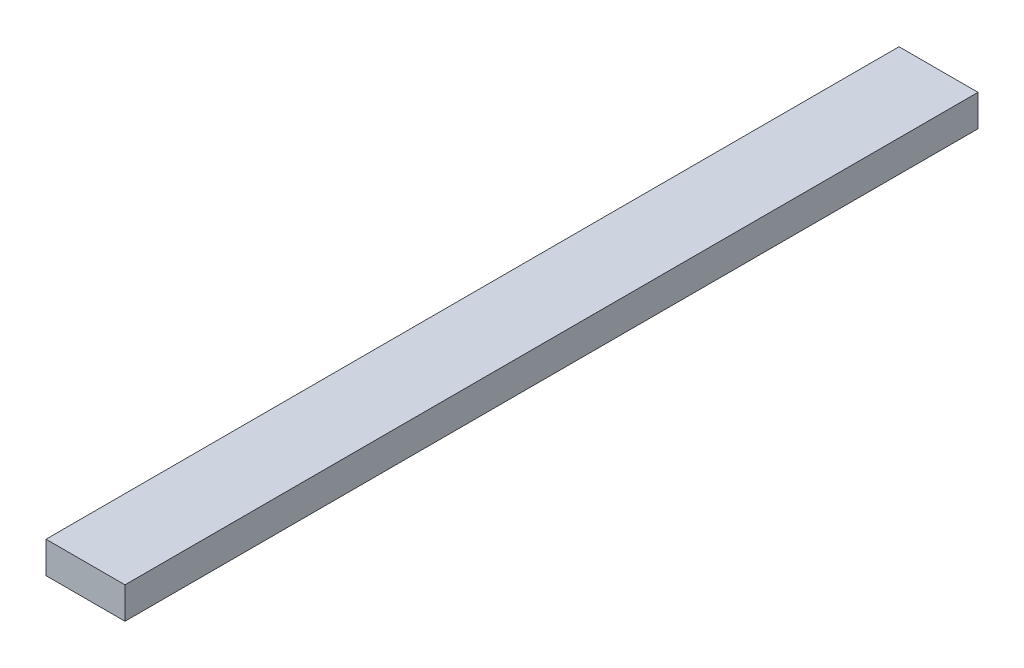
ISO-10303-21;
HEADER;
FILE_DESCRIPTION(('STEP AP214'),'2;1');
FILE_NAME('part.step','',(''),(''),'','','');
FILE_SCHEMA(('AUTOMOTIVE_DESIGN { 1 0 10303 214 1 1 1 1 }'));
ENDSEC;
DATA;
#1=APPLICATION_CONTEXT('core data for automotive mechanical design processes');
#2=APPLICATION_PROTOCOL_DEFINITION('international standard','automotive_design',2000,#1);
#3=PRODUCT_CONTEXT('',#1,'mechanical');
#4=PRODUCT('Part','Part','',(#3));
#5=PRODUCT_RELATED_PRODUCT_CATEGORY('part','',(#4));
#6=PRODUCT_DEFINITION_FORMATION('','',#4);
#7=PRODUCT_DEFINITION_CONTEXT('part definition',#1,'design');
#8=PRODUCT_DEFINITION('design','',#6,#7);
#9=PRODUCT_DEFINITION_SHAPE('','',#8);
#10=(LENGTH_UNIT() NAMED_UNIT(*) SI_UNIT(.MILLI.,.METRE.));
#11=(NAMED_UNIT(*) PLANE_ANGLE_UNIT() SI_UNIT($,.RADIAN.));
#12=(NAMED_UNIT(*) SI_UNIT($,.STERADIAN.) SOLID_ANGLE_UNIT());
#13=UNCERTAINTY_MEASURE_WITH_UNIT(LENGTH_MEASURE(1.E-05),#10,'distance_accuracy_value','');
#14=(GEOMETRIC_REPRESENTATION_CONTEXT(3) GLOBAL_UNCERTAINTY_ASSIGNED_CONTEXT((#13)) GLOBAL_UNIT_ASSIGNED_CONTEXT((#10,
#11,#12)) REPRESENTATION_CONTEXT('',''));
#15=CARTESIAN_POINT('',(0.,0.,0.));
#16=DIRECTION('',(0.,0.,1.));
#17=DIRECTION('',(1.,0.,0.));
#18=AXIS2_PLACEMENT_3D('',#15,#16,#17);
#19=CARTESIAN_POINT('',(0.,10.,0.));
#20=DIRECTION('',(1.,0.,0.));
#21=DIRECTION('',(0.,0.,-1.));
#22=AXIS2_PLACEMENT_3D('',#19,#20,#21);
#23=PLANE('',#22);
#24=DIRECTION('',(0.,0.,1.));
#25=VECTOR('',#24,1.);
#26=CARTESIAN_POINT('',(0.,0.,0.));
#27=LINE('',#26,#25);
#28=CARTESIAN_POINT('',(0.,0.,-270.));
#29=VERTEX_POINT('',#28);
#30=CARTESIAN_POINT('',(0.,0.,0.));
#31=VERTEX_POINT('',#30);
#32=EDGE_CURVE('E96',#29,#31,#27,.T.);
#33=ORIENTED_EDGE('',*,*,#32,.T.);
#34=DIRECTION('',(0.,-1.,0.));
#35=VECTOR('',#34,1.);
#36=CARTESIAN_POINT('',(0.,10.,0.));
#37=LINE('',#36,#35);
#38=CARTESIAN_POINT('',(0.,10.,0.));
#39=VERTEX_POINT('',#38);
#40=EDGE_CURVE('E11',#39,#31,#37,.T.);
#41=ORIENTED_EDGE('',*,*,#40,.F.);
#42=DIRECTION('',(0.,0.,1.));
#43=VECTOR('',#42,1.);
#44=CARTESIAN_POINT('',(0.,10.,0.));
#45=LINE('',#44,#43);
#46=CARTESIAN_POINT('',(0.,10.,-270.));
#47=VERTEX_POINT('',#46);
#48=EDGE_CURVE('E84',#47,#39,#45,.T.);
#49=ORIENTED_EDGE('',*,*,#48,.F.);
#50=DIRECTION('',(0.,-1.,0.));
#51=VECTOR('',#50,1.);
#52=CARTESIAN_POINT('',(0.,10.,-270.));
#53=LINE('',#52,#51);
#54=EDGE_CURVE('E92',#47,#29,#53,.T.);
#55=ORIENTED_EDGE('',*,*,#54,.T.);
#56=EDGE_LOOP('',(#33,#41,#49,#55));
#57=FACE_BOUND('',#56,.T.);
#58=ADVANCED_FACE('F33',(#57),#23,.F.);
#59=CARTESIAN_POINT('',(0.,10.,0.));
#60=DIRECTION('',(0.,0.,-1.));
#61=DIRECTION('',(-1.,0.,0.));
#62=AXIS2_PLACEMENT_3D('',#59,#60,#61);
#63=PLANE('',#62);
#64=DIRECTION('',(1.,0.,0.));
#65=VECTOR('',#64,1.);
#66=CARTESIAN_POINT('',(0.,0.,0.));
#67=LINE('',#66,#65);
#68=CARTESIAN_POINT('',(25.,0.,0.));
#69=VERTEX_POINT('',#68);
#70=EDGE_CURVE('E88',#31,#69,#67,.T.);
#71=ORIENTED_EDGE('',*,*,#70,.T.);
#72=DIRECTION('',(0.,-1.,0.));
#73=VECTOR('',#72,1.);
#74=CARTESIAN_POINT('',(25.,10.,0.));
#75=LINE('',#74,#73);
#76=CARTESIAN_POINT('',(25.,10.,0.));
#77=VERTEX_POINT('',#76);
#78=EDGE_CURVE('E41',#77,#69,#75,.T.);
#79=ORIENTED_EDGE('',*,*,#78,.F.);
#80=DIRECTION('',(1.,0.,0.));
#81=VECTOR('',#80,1.);
#82=CARTESIAN_POINT('',(0.,10.,0.));
#83=LINE('',#82,#81);
#84=EDGE_CURVE('E79',#39,#77,#83,.T.);
#85=ORIENTED_EDGE('',*,*,#84,.F.);
#86=ORIENTED_EDGE('',*,*,#40,.T.);
#87=EDGE_LOOP('',(#71,#79,#85,#86));
#88=FACE_BOUND('',#87,.T.);
#89=ADVANCED_FACE('F87',(#88),#63,.F.);
#90=CARTESIAN_POINT('',(25.,10.,0.));
#91=DIRECTION('',(-1.,0.,0.));
#92=DIRECTION('',(0.,0.,1.));
#93=AXIS2_PLACEMENT_3D('',#90,#91,#92);
#94=PLANE('',#93);
#95=DIRECTION('',(0.,0.,-1.));
#96=VECTOR('',#95,1.);
#97=CARTESIAN_POINT('',(25.,0.,0.));
#98=LINE('',#97,#96);
#99=CARTESIAN_POINT('',(25.,0.,-270.));
#100=VERTEX_POINT('',#99);
#101=EDGE_CURVE('E66',#69,#100,#98,.T.);
#102=ORIENTED_EDGE('',*,*,#101,.T.);
#103=DIRECTION('',(0.,-1.,0.));
#104=VECTOR('',#103,1.);
#105=CARTESIAN_POINT('',(25.,10.,-270.));
#106=LINE('',#105,#104);
#107=CARTESIAN_POINT('',(25.,10.,-270.));
#108=VERTEX_POINT('',#107);
#109=EDGE_CURVE('E89',#108,#100,#106,.T.);
#110=ORIENTED_EDGE('',*,*,#109,.F.);
#111=DIRECTION('',(0.,0.,-1.));
#112=VECTOR('',#111,1.);
#113=CARTESIAN_POINT('',(25.,10.,0.));
#114=LINE('',#113,#112);
#115=EDGE_CURVE('E82',#77,#108,#114,.T.);
#116=ORIENTED_EDGE('',*,*,#115,.F.);
#117=ORIENTED_EDGE('',*,*,#78,.T.);
#118=EDGE_LOOP('',(#102,#110,#116,#117));
#119=FACE_BOUND('',#118,.T.);
#120=ADVANCED_FACE('F90',(#119),#94,.F.);
#121=CARTESIAN_POINT('',(0.,10.,-270.));
#122=DIRECTION('',(0.,0.,1.));
#123=DIRECTION('',(1.,0.,0.));
#124=AXIS2_PLACEMENT_3D('',#121,#122,#123);
#125=PLANE('',#124);
#126=DIRECTION('',(-1.,0.,0.));
#127=VECTOR('',#126,1.);
#128=CARTESIAN_POINT('',(0.,0.,-270.));
#129=LINE('',#128,#127);
#130=EDGE_CURVE('E72',#100,#29,#129,.T.);
#131=ORIENTED_EDGE('',*,*,#130,.T.);
#132=ORIENTED_EDGE('',*,*,#54,.F.);
#133=DIRECTION('',(-1.,0.,0.));
#134=VECTOR('',#133,1.);
#135=CARTESIAN_POINT('',(0.,10.,-270.));
#136=LINE('',#135,#134);
#137=EDGE_CURVE('E49',#108,#47,#136,.T.);
#138=ORIENTED_EDGE('',*,*,#137,.F.);
#139=ORIENTED_EDGE('',*,*,#109,.T.);
#140=EDGE_LOOP('',(#131,#132,#138,#139));
#141=FACE_BOUND('',#140,.T.);
#142=ADVANCED_FACE('F103',(#141),#125,.F.);
#143=CARTESIAN_POINT('',(0.,10.,0.));
#144=DIRECTION('',(0.,-1.,0.));
#145=DIRECTION('',(0.,0.,-1.));
#146=AXIS2_PLACEMENT_3D('',#143,#144,#145);
#147=PLANE('',#146);
#148=ORIENTED_EDGE('',*,*,#48,.T.);
#149=ORIENTED_EDGE('',*,*,#84,.T.);
#150=ORIENTED_EDGE('',*,*,#115,.T.);
#151=ORIENTED_EDGE('',*,*,#137,.T.);
#152=EDGE_LOOP('',(#148,#149,#150,#151));
#153=FACE_BOUND('',#152,.T.);
#154=ADVANCED_FACE('F80',(#153),#147,.F.);
#155=CARTESIAN_POINT('',(0.,0.,0.));
#156=DIRECTION('',(0.,-1.,0.));
#157=DIRECTION('',(0.,0.,-1.));
#158=AXIS2_PLACEMENT_3D('',#155,#156,#157);
#159=PLANE('',#158);
#160=ORIENTED_EDGE('',*,*,#32,.F.);
#161=ORIENTED_EDGE('',*,*,#130,.F.);
#162=ORIENTED_EDGE('',*,*,#101,.F.);
#163=ORIENTED_EDGE('',*,*,#70,.F.);
#164=EDGE_LOOP('',(#160,#161,#162,#163));
#165=FACE_BOUND('',#164,.T.);
#166=ADVANCED_FACE('F106',(#165),#159,.T.);
#167=CLOSED_SHELL('',(#58,#89,#120,#142,#154,#166));
#168=MANIFOLD_SOLID_BREP('B2',#167);
#169=ADVANCED_BREP_SHAPE_REPRESENTATION('',(#18,#168),#14);
#170=SHAPE_DEFINITION_REPRESENTATION(#9,#169);
ENDSEC;
END-ISO-10303-21;
